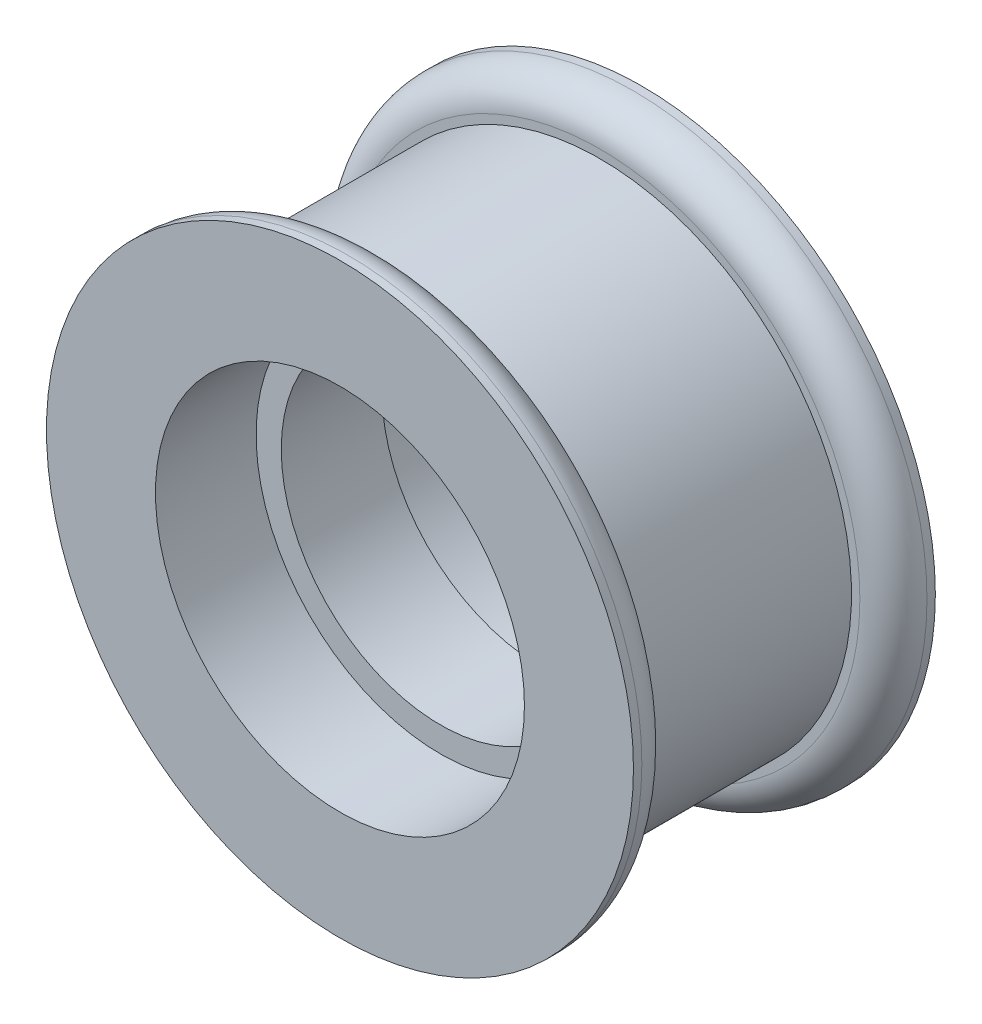
ISO-10303-21;
HEADER;
FILE_DESCRIPTION(('STEP AP214'),'2;1');
FILE_NAME('part.step','',(''),(''),'','','');
FILE_SCHEMA(('AUTOMOTIVE_DESIGN { 1 0 10303 214 1 1 1 1 }'));
ENDSEC;
DATA;
#1=APPLICATION_CONTEXT('core data for automotive mechanical design processes');
#2=APPLICATION_PROTOCOL_DEFINITION('international standard','automotive_design',2000,#1);
#3=PRODUCT_CONTEXT('',#1,'mechanical');
#4=PRODUCT('Part','Part','',(#3));
#5=PRODUCT_RELATED_PRODUCT_CATEGORY('part','',(#4));
#6=PRODUCT_DEFINITION_FORMATION('','',#4);
#7=PRODUCT_DEFINITION_CONTEXT('part definition',#1,'design');
#8=PRODUCT_DEFINITION('design','',#6,#7);
#9=PRODUCT_DEFINITION_SHAPE('','',#8);
#10=(LENGTH_UNIT() NAMED_UNIT(*) SI_UNIT(.MILLI.,.METRE.));
#11=(NAMED_UNIT(*) PLANE_ANGLE_UNIT() SI_UNIT($,.RADIAN.));
#12=(NAMED_UNIT(*) SI_UNIT($,.STERADIAN.) SOLID_ANGLE_UNIT());
#13=UNCERTAINTY_MEASURE_WITH_UNIT(LENGTH_MEASURE(1.E-05),#10,'distance_accuracy_value','');
#14=(GEOMETRIC_REPRESENTATION_CONTEXT(3) GLOBAL_UNCERTAINTY_ASSIGNED_CONTEXT((#13)) GLOBAL_UNIT_ASSIGNED_CONTEXT((#10,
#11,#12)) REPRESENTATION_CONTEXT('',''));
#15=CARTESIAN_POINT('',(0.,0.,0.));
#16=DIRECTION('',(0.,0.,1.));
#17=DIRECTION('',(1.,0.,0.));
#18=AXIS2_PLACEMENT_3D('',#15,#16,#17);
#19=CARTESIAN_POINT('',(0.,0.,6.5));
#20=DIRECTION('',(0.,0.,-1.));
#21=DIRECTION('',(-1.,0.,0.));
#22=AXIS2_PLACEMENT_3D('',#19,#20,#21);
#23=CYLINDRICAL_SURFACE('',#22,15.);
#24=CARTESIAN_POINT('',(0.,0.,6.5));
#25=DIRECTION('',(0.,0.,1.));
#26=DIRECTION('',(1.,0.,0.));
#27=AXIS2_PLACEMENT_3D('',#24,#25,#26);
#28=CIRCLE('',#27,15.);
#29=CARTESIAN_POINT('',(-15.,0.,6.5));
#30=VERTEX_POINT('',#29);
#31=EDGE_CURVE('E52',#30,#30,#28,.T.);
#32=CARTESIAN_POINT('',(0.,0.,-6.5));
#33=DIRECTION('',(0.,0.,-1.));
#34=DIRECTION('',(-1.,0.,0.));
#35=AXIS2_PLACEMENT_3D('',#32,#33,#34);
#36=CIRCLE('',#35,15.);
#37=CARTESIAN_POINT('',(-15.,0.,-6.5));
#38=VERTEX_POINT('',#37);
#39=EDGE_CURVE('E58',#38,#38,#36,.T.);
#40=CARTESIAN_POINT('',(-15.,0.,6.5));
#41=CARTESIAN_POINT('',(-15.,0.,6.36458333333333));
#42=CARTESIAN_POINT('',(-15.,0.,6.22916666666667));
#43=CARTESIAN_POINT('',(-15.,0.,5.95833333333333));
#44=CARTESIAN_POINT('',(-15.,0.,5.82291666666667));
#45=CARTESIAN_POINT('',(-15.,0.,5.55208333333333));
#46=CARTESIAN_POINT('',(-15.,0.,5.41666666666667));
#47=CARTESIAN_POINT('',(-15.,0.,5.14583333333333));
#48=CARTESIAN_POINT('',(-15.,0.,5.01041666666667));
#49=CARTESIAN_POINT('',(-15.,0.,4.73958333333333));
#50=CARTESIAN_POINT('',(-15.,0.,4.60416666666667));
#51=CARTESIAN_POINT('',(-15.,0.,4.33333333333333));
#52=CARTESIAN_POINT('',(-15.,0.,4.19791666666667));
#53=CARTESIAN_POINT('',(-15.,0.,3.92708333333333));
#54=CARTESIAN_POINT('',(-15.,0.,3.79166666666667));
#55=CARTESIAN_POINT('',(-15.,0.,3.52083333333333));
#56=CARTESIAN_POINT('',(-15.,0.,3.38541666666667));
#57=CARTESIAN_POINT('',(-15.,0.,3.11458333333333));
#58=CARTESIAN_POINT('',(-15.,0.,2.97916666666667));
#59=CARTESIAN_POINT('',(-15.,0.,2.70833333333333));
#60=CARTESIAN_POINT('',(-15.,0.,2.57291666666667));
#61=CARTESIAN_POINT('',(-15.,0.,2.30208333333333));
#62=CARTESIAN_POINT('',(-15.,0.,2.16666666666667));
#63=CARTESIAN_POINT('',(-15.,0.,1.89583333333333));
#64=CARTESIAN_POINT('',(-15.,0.,1.76041666666667));
#65=CARTESIAN_POINT('',(-15.,0.,1.48958333333333));
#66=CARTESIAN_POINT('',(-15.,0.,1.35416666666667));
#67=CARTESIAN_POINT('',(-15.,0.,1.08333333333333));
#68=CARTESIAN_POINT('',(-15.,0.,0.947916666666666));
#69=CARTESIAN_POINT('',(-15.,0.,0.677083333333332));
#70=CARTESIAN_POINT('',(-15.,0.,0.541666666666666));
#71=CARTESIAN_POINT('',(-15.,0.,0.270833333333333));
#72=CARTESIAN_POINT('',(-15.,0.,0.135416666666666));
#73=CARTESIAN_POINT('',(-15.,0.,-0.135416666666668));
#74=CARTESIAN_POINT('',(-15.,0.,-0.270833333333334));
#75=CARTESIAN_POINT('',(-15.,0.,-0.541666666666668));
#76=CARTESIAN_POINT('',(-15.,0.,-0.677083333333334));
#77=CARTESIAN_POINT('',(-15.,0.,-0.947916666666667));
#78=CARTESIAN_POINT('',(-15.,0.,-1.08333333333333));
#79=CARTESIAN_POINT('',(-15.,0.,-1.35416666666667));
#80=CARTESIAN_POINT('',(-15.,0.,-1.48958333333333));
#81=CARTESIAN_POINT('',(-15.,0.,-1.76041666666667));
#82=CARTESIAN_POINT('',(-15.,0.,-1.89583333333333));
#83=CARTESIAN_POINT('',(-15.,0.,-2.16666666666667));
#84=CARTESIAN_POINT('',(-15.,0.,-2.30208333333333));
#85=CARTESIAN_POINT('',(-15.,0.,-2.57291666666667));
#86=CARTESIAN_POINT('',(-15.,0.,-2.70833333333333));
#87=CARTESIAN_POINT('',(-15.,0.,-2.97916666666667));
#88=CARTESIAN_POINT('',(-15.,0.,-3.11458333333333));
#89=CARTESIAN_POINT('',(-15.,0.,-3.38541666666667));
#90=CARTESIAN_POINT('',(-15.,0.,-3.52083333333333));
#91=CARTESIAN_POINT('',(-15.,0.,-3.79166666666667));
#92=CARTESIAN_POINT('',(-15.,0.,-3.92708333333333));
#93=CARTESIAN_POINT('',(-15.,0.,-4.19791666666667));
#94=CARTESIAN_POINT('',(-15.,0.,-4.33333333333333));
#95=CARTESIAN_POINT('',(-15.,0.,-4.60416666666667));
#96=CARTESIAN_POINT('',(-15.,0.,-4.73958333333333));
#97=CARTESIAN_POINT('',(-15.,0.,-5.01041666666667));
#98=CARTESIAN_POINT('',(-15.,0.,-5.14583333333333));
#99=CARTESIAN_POINT('',(-15.,0.,-5.41666666666667));
#100=CARTESIAN_POINT('',(-15.,0.,-5.55208333333333));
#101=CARTESIAN_POINT('',(-15.,0.,-5.82291666666667));
#102=CARTESIAN_POINT('',(-15.,0.,-5.95833333333333));
#103=CARTESIAN_POINT('',(-15.,0.,-6.22916666666667));
#104=CARTESIAN_POINT('',(-15.,0.,-6.36458333333333));
#105=CARTESIAN_POINT('',(-15.,0.,-6.5));
#106=B_SPLINE_CURVE_WITH_KNOTS('',3,(#40,#41,#42,#43,#44,#45,#46,#47,#48,#49,#50,#51,#52,#53,
#54,#55,#56,#57,#58,#59,#60,#61,#62,#63,#64,#65,#66,#67,#68,#69,#70,#71,#72,#73,#74,#75,#76,#77,
#78,#79,#80,#81,#82,#83,#84,#85,#86,#87,#88,#89,#90,#91,#92,#93,#94,#95,#96,#97,#98,#99,#100,
#101,#102,#103,#104,#105),.UNSPECIFIED.,.F.,.F.,(4,2,2,2,2,2,2,2,2,2,2,2,2,2,2,2,2,2,2,2,2,2,2,
2,2,2,2,2,2,2,2,2,4),(0.,0.40625,0.8125,1.21875,1.625,2.03125,2.4375,2.84375,3.25,3.65625,
4.0625,4.46875,4.875,5.28125,5.6875,6.09375,6.5,6.90625,7.3125,7.71875,8.125,8.53125,8.9375,
9.34375,9.75,10.15625,10.5625,10.96875,11.375,11.78125,12.1875,12.59375,13.),.UNSPECIFIED.);
#107=EDGE_CURVE('BSEAM32',#30,#38,#106,.T.);
#108=ORIENTED_EDGE('',*,*,#31,.F.);
#109=ORIENTED_EDGE('',*,*,#39,.F.);
#110=ORIENTED_EDGE('',*,*,#107,.T.);
#111=ORIENTED_EDGE('',*,*,#107,.F.);
#112=EDGE_LOOP('',(#108,#110,#109,#111));
#113=FACE_BOUND('',#112,.T.);
#114=ADVANCED_FACE('F32',(#113),#23,.T.);
#115=CARTESIAN_POINT('',(0.,0.,6.5));
#116=DIRECTION('',(0.,0.,1.));
#117=DIRECTION('',(1.,0.,0.));
#118=AXIS2_PLACEMENT_3D('',#115,#116,#117);
#119=PLANE('',#118);
#120=CARTESIAN_POINT('',(0.,0.,6.5));
#121=DIRECTION('',(0.,0.,1.));
#122=DIRECTION('',(1.,0.,0.));
#123=AXIS2_PLACEMENT_3D('',#120,#121,#122);
#124=CIRCLE('',#123,15.5);
#125=CARTESIAN_POINT('',(15.5,0.,6.5));
#126=VERTEX_POINT('',#125);
#127=EDGE_CURVE('E10',#126,#126,#124,.F.);
#128=ORIENTED_EDGE('',*,*,#127,.T.);
#129=EDGE_LOOP('',(#128));
#130=FACE_BOUND('',#129,.T.);
#131=ORIENTED_EDGE('',*,*,#31,.T.);
#132=EDGE_LOOP('',(#131));
#133=FACE_BOUND('',#132,.T.);
#134=ADVANCED_FACE('F118',(#130,#133),#119,.F.);
#135=CARTESIAN_POINT('',(0.,0.,9.));
#136=DIRECTION('',(0.,0.,-1.));
#137=DIRECTION('',(-1.,0.,0.));
#138=AXIS2_PLACEMENT_3D('',#135,#136,#137);
#139=CYLINDRICAL_SURFACE('',#138,17.5);
#140=CARTESIAN_POINT('',(0.,0.,8.5));
#141=DIRECTION('',(0.,0.,1.));
#142=DIRECTION('',(1.,0.,0.));
#143=AXIS2_PLACEMENT_3D('',#140,#141,#142);
#144=CIRCLE('',#143,17.5);
#145=CARTESIAN_POINT('',(17.5,0.,8.5));
#146=VERTEX_POINT('',#145);
#147=EDGE_CURVE('E39',#146,#146,#144,.T.);
#148=ORIENTED_EDGE('',*,*,#147,.T.);
#149=EDGE_LOOP('',(#148));
#150=FACE_BOUND('',#149,.T.);
#151=CARTESIAN_POINT('',(0.,0.,9.));
#152=DIRECTION('',(0.,0.,1.));
#153=DIRECTION('',(1.,0.,0.));
#154=AXIS2_PLACEMENT_3D('',#151,#152,#153);
#155=CIRCLE('',#154,17.5);
#156=CARTESIAN_POINT('',(17.5,0.,9.));
#157=VERTEX_POINT('',#156);
#158=EDGE_CURVE('E55',#157,#157,#155,.T.);
#159=ORIENTED_EDGE('',*,*,#158,.F.);
#160=EDGE_LOOP('',(#159));
#161=FACE_BOUND('',#160,.T.);
#162=ADVANCED_FACE('F124',(#150,#161),#139,.T.);
#163=CARTESIAN_POINT('',(0.,0.,9.));
#164=DIRECTION('',(0.,0.,1.));
#165=DIRECTION('',(1.,0.,0.));
#166=AXIS2_PLACEMENT_3D('',#163,#164,#165);
#167=PLANE('',#166);
#168=CARTESIAN_POINT('',(0.,0.,9.));
#169=DIRECTION('',(0.,0.,1.));
#170=DIRECTION('',(1.,0.,0.));
#171=AXIS2_PLACEMENT_3D('',#168,#169,#170);
#172=CIRCLE('',#171,11.);
#173=CARTESIAN_POINT('',(11.,0.,9.));
#174=VERTEX_POINT('',#173);
#175=EDGE_CURVE('E65',#174,#174,#172,.T.);
#176=ORIENTED_EDGE('',*,*,#175,.F.);
#177=EDGE_LOOP('',(#176));
#178=FACE_BOUND('',#177,.T.);
#179=ORIENTED_EDGE('',*,*,#158,.T.);
#180=EDGE_LOOP('',(#179));
#181=FACE_BOUND('',#180,.T.);
#182=ADVANCED_FACE('F113',(#178,#181),#167,.T.);
#183=CARTESIAN_POINT('',(0.,0.,-6.5));
#184=DIRECTION('',(0.,0.,-1.));
#185=DIRECTION('',(1.,0.,0.));
#186=AXIS2_PLACEMENT_3D('',#183,#184,#185);
#187=PLANE('',#186);
#188=CARTESIAN_POINT('',(0.,0.,-6.5));
#189=DIRECTION('',(0.,0.,-1.));
#190=DIRECTION('',(-1.,0.,0.));
#191=AXIS2_PLACEMENT_3D('',#188,#189,#190);
#192=CIRCLE('',#191,15.5);
#193=CARTESIAN_POINT('',(-15.5,0.,-6.5));
#194=VERTEX_POINT('',#193);
#195=EDGE_CURVE('E47',#194,#194,#192,.F.);
#196=ORIENTED_EDGE('',*,*,#195,.T.);
#197=EDGE_LOOP('',(#196));
#198=FACE_BOUND('',#197,.T.);
#199=ORIENTED_EDGE('',*,*,#39,.T.);
#200=EDGE_LOOP('',(#199));
#201=FACE_BOUND('',#200,.T.);
#202=ADVANCED_FACE('F107',(#198,#201),#187,.F.);
#203=CARTESIAN_POINT('',(0.,0.,-9.));
#204=DIRECTION('',(0.,0.,1.));
#205=DIRECTION('',(1.,0.,0.));
#206=AXIS2_PLACEMENT_3D('',#203,#204,#205);
#207=CYLINDRICAL_SURFACE('',#206,17.5);
#208=CARTESIAN_POINT('',(0.,0.,-8.5));
#209=DIRECTION('',(0.,0.,-1.));
#210=DIRECTION('',(-1.,0.,0.));
#211=AXIS2_PLACEMENT_3D('',#208,#209,#210);
#212=CIRCLE('',#211,17.5);
#213=CARTESIAN_POINT('',(-17.5,0.,-8.5));
#214=VERTEX_POINT('',#213);
#215=EDGE_CURVE('E43',#214,#214,#212,.T.);
#216=ORIENTED_EDGE('',*,*,#215,.T.);
#217=EDGE_LOOP('',(#216));
#218=FACE_BOUND('',#217,.T.);
#219=CARTESIAN_POINT('',(0.,0.,-9.));
#220=DIRECTION('',(0.,0.,1.));
#221=DIRECTION('',(1.,0.,0.));
#222=AXIS2_PLACEMENT_3D('',#219,#220,#221);
#223=CIRCLE('',#222,17.5);
#224=CARTESIAN_POINT('',(17.5,0.,-9.));
#225=VERTEX_POINT('',#224);
#226=EDGE_CURVE('E61',#225,#225,#223,.T.);
#227=ORIENTED_EDGE('',*,*,#226,.T.);
#228=EDGE_LOOP('',(#227));
#229=FACE_BOUND('',#228,.T.);
#230=ADVANCED_FACE('F102',(#218,#229),#207,.T.);
#231=CARTESIAN_POINT('',(0.,0.,-9.));
#232=DIRECTION('',(0.,0.,-1.));
#233=DIRECTION('',(1.,0.,0.));
#234=AXIS2_PLACEMENT_3D('',#231,#232,#233);
#235=PLANE('',#234);
#236=CARTESIAN_POINT('',(0.,0.,-9.));
#237=DIRECTION('',(0.,0.,-1.));
#238=DIRECTION('',(-1.,0.,0.));
#239=AXIS2_PLACEMENT_3D('',#236,#237,#238);
#240=CIRCLE('',#239,11.);
#241=CARTESIAN_POINT('',(-11.,0.,-9.));
#242=VERTEX_POINT('',#241);
#243=EDGE_CURVE('E71',#242,#242,#240,.T.);
#244=ORIENTED_EDGE('',*,*,#243,.F.);
#245=EDGE_LOOP('',(#244));
#246=FACE_BOUND('',#245,.T.);
#247=ORIENTED_EDGE('',*,*,#226,.F.);
#248=EDGE_LOOP('',(#247));
#249=FACE_BOUND('',#248,.T.);
#250=ADVANCED_FACE('F98',(#246,#249),#235,.T.);
#251=CARTESIAN_POINT('',(0.,0.,3.));
#252=DIRECTION('',(0.,0.,1.));
#253=DIRECTION('',(1.,0.,0.));
#254=AXIS2_PLACEMENT_3D('',#251,#252,#253);
#255=CYLINDRICAL_SURFACE('',#254,11.);
#256=CARTESIAN_POINT('',(0.,0.,3.));
#257=DIRECTION('',(0.,0.,1.));
#258=DIRECTION('',(1.,0.,0.));
#259=AXIS2_PLACEMENT_3D('',#256,#257,#258);
#260=CIRCLE('',#259,11.);
#261=CARTESIAN_POINT('',(11.,0.,3.));
#262=VERTEX_POINT('',#261);
#263=EDGE_CURVE('E64',#262,#262,#260,.T.);
#264=ORIENTED_EDGE('',*,*,#263,.F.);
#265=EDGE_LOOP('',(#264));
#266=FACE_BOUND('',#265,.T.);
#267=ORIENTED_EDGE('',*,*,#175,.T.);
#268=EDGE_LOOP('',(#267));
#269=FACE_BOUND('',#268,.T.);
#270=ADVANCED_FACE('F101',(#266,#269),#255,.F.);
#271=CARTESIAN_POINT('',(0.,0.,3.));
#272=DIRECTION('',(0.,0.,1.));
#273=DIRECTION('',(1.,0.,0.));
#274=AXIS2_PLACEMENT_3D('',#271,#272,#273);
#275=PLANE('',#274);
#276=CARTESIAN_POINT('',(0.,0.,3.));
#277=DIRECTION('',(0.,0.,1.));
#278=DIRECTION('',(1.,0.,0.));
#279=AXIS2_PLACEMENT_3D('',#276,#277,#278);
#280=CIRCLE('',#279,9.5);
#281=CARTESIAN_POINT('',(9.5,0.,3.));
#282=VERTEX_POINT('',#281);
#283=EDGE_CURVE('E74',#282,#282,#280,.T.);
#284=ORIENTED_EDGE('',*,*,#283,.F.);
#285=EDGE_LOOP('',(#284));
#286=FACE_BOUND('',#285,.T.);
#287=ORIENTED_EDGE('',*,*,#263,.T.);
#288=EDGE_LOOP('',(#287));
#289=FACE_BOUND('',#288,.T.);
#290=ADVANCED_FACE('F94',(#286,#289),#275,.T.);
#291=CARTESIAN_POINT('',(0.,0.,-3.));
#292=DIRECTION('',(0.,0.,-1.));
#293=DIRECTION('',(-1.,0.,0.));
#294=AXIS2_PLACEMENT_3D('',#291,#292,#293);
#295=CYLINDRICAL_SURFACE('',#294,11.);
#296=CARTESIAN_POINT('',(0.,0.,-3.));
#297=DIRECTION('',(0.,0.,-1.));
#298=DIRECTION('',(-1.,0.,0.));
#299=AXIS2_PLACEMENT_3D('',#296,#297,#298);
#300=CIRCLE('',#299,11.);
#301=CARTESIAN_POINT('',(-11.,0.,-3.));
#302=VERTEX_POINT('',#301);
#303=EDGE_CURVE('E68',#302,#302,#300,.T.);
#304=ORIENTED_EDGE('',*,*,#303,.F.);
#305=EDGE_LOOP('',(#304));
#306=FACE_BOUND('',#305,.T.);
#307=ORIENTED_EDGE('',*,*,#243,.T.);
#308=EDGE_LOOP('',(#307));
#309=FACE_BOUND('',#308,.T.);
#310=ADVANCED_FACE('F88',(#306,#309),#295,.F.);
#311=CARTESIAN_POINT('',(0.,0.,-3.));
#312=DIRECTION('',(0.,0.,-1.));
#313=DIRECTION('',(-1.,0.,0.));
#314=AXIS2_PLACEMENT_3D('',#311,#312,#313);
#315=PLANE('',#314);
#316=CARTESIAN_POINT('',(0.,0.,-3.));
#317=DIRECTION('',(0.,0.,-1.));
#318=DIRECTION('',(-1.,0.,0.));
#319=AXIS2_PLACEMENT_3D('',#316,#317,#318);
#320=CIRCLE('',#319,9.5);
#321=CARTESIAN_POINT('',(-9.5,0.,-3.));
#322=VERTEX_POINT('',#321);
#323=EDGE_CURVE('E79',#322,#322,#320,.T.);
#324=ORIENTED_EDGE('',*,*,#323,.F.);
#325=EDGE_LOOP('',(#324));
#326=FACE_BOUND('',#325,.T.);
#327=ORIENTED_EDGE('',*,*,#303,.T.);
#328=EDGE_LOOP('',(#327));
#329=FACE_BOUND('',#328,.T.);
#330=ADVANCED_FACE('F85',(#326,#329),#315,.T.);
#331=CARTESIAN_POINT('',(0.,0.,9.));
#332=DIRECTION('',(0.,0.,-1.));
#333=DIRECTION('',(-1.,0.,0.));
#334=AXIS2_PLACEMENT_3D('',#331,#332,#333);
#335=CYLINDRICAL_SURFACE('',#334,9.5);
#336=ORIENTED_EDGE('',*,*,#283,.T.);
#337=EDGE_LOOP('',(#336));
#338=FACE_BOUND('',#337,.T.);
#339=ORIENTED_EDGE('',*,*,#323,.T.);
#340=EDGE_LOOP('',(#339));
#341=FACE_BOUND('',#340,.T.);
#342=ADVANCED_FACE('F83',(#338,#341),#335,.F.);
#343=CARTESIAN_POINT('',(0.,0.,-8.5));
#344=DIRECTION('',(0.,0.,-1.));
#345=DIRECTION('',(-1.,0.,0.));
#346=AXIS2_PLACEMENT_3D('',#343,#344,#345);
#347=TOROIDAL_SURFACE('',#346,15.5,2.);
#348=ORIENTED_EDGE('',*,*,#215,.F.);
#349=EDGE_LOOP('',(#348));
#350=FACE_BOUND('',#349,.T.);
#351=ORIENTED_EDGE('',*,*,#195,.F.);
#352=EDGE_LOOP('',(#351));
#353=FACE_BOUND('',#352,.T.);
#354=ADVANCED_FACE('F129',(#350,#353),#347,.T.);
#355=CARTESIAN_POINT('',(0.,0.,8.5));
#356=DIRECTION('',(0.,0.,1.));
#357=DIRECTION('',(1.,0.,0.));
#358=AXIS2_PLACEMENT_3D('',#355,#356,#357);
#359=TOROIDAL_SURFACE('',#358,15.5,2.);
#360=ORIENTED_EDGE('',*,*,#127,.F.);
#361=EDGE_LOOP('',(#360));
#362=FACE_BOUND('',#361,.T.);
#363=ORIENTED_EDGE('',*,*,#147,.F.);
#364=EDGE_LOOP('',(#363));
#365=FACE_BOUND('',#364,.T.);
#366=ADVANCED_FACE('F34',(#362,#365),#359,.T.);
#367=CLOSED_SHELL('',(#114,#134,#162,#182,#202,#230,#250,#270,#290,#310,#330,#342,#354,#366));
#368=MANIFOLD_SOLID_BREP('B2',#367);
#369=ADVANCED_BREP_SHAPE_REPRESENTATION('',(#18,#368),#14);
#370=SHAPE_DEFINITION_REPRESENTATION(#9,#369);
ENDSEC;
END-ISO-10303-21;
